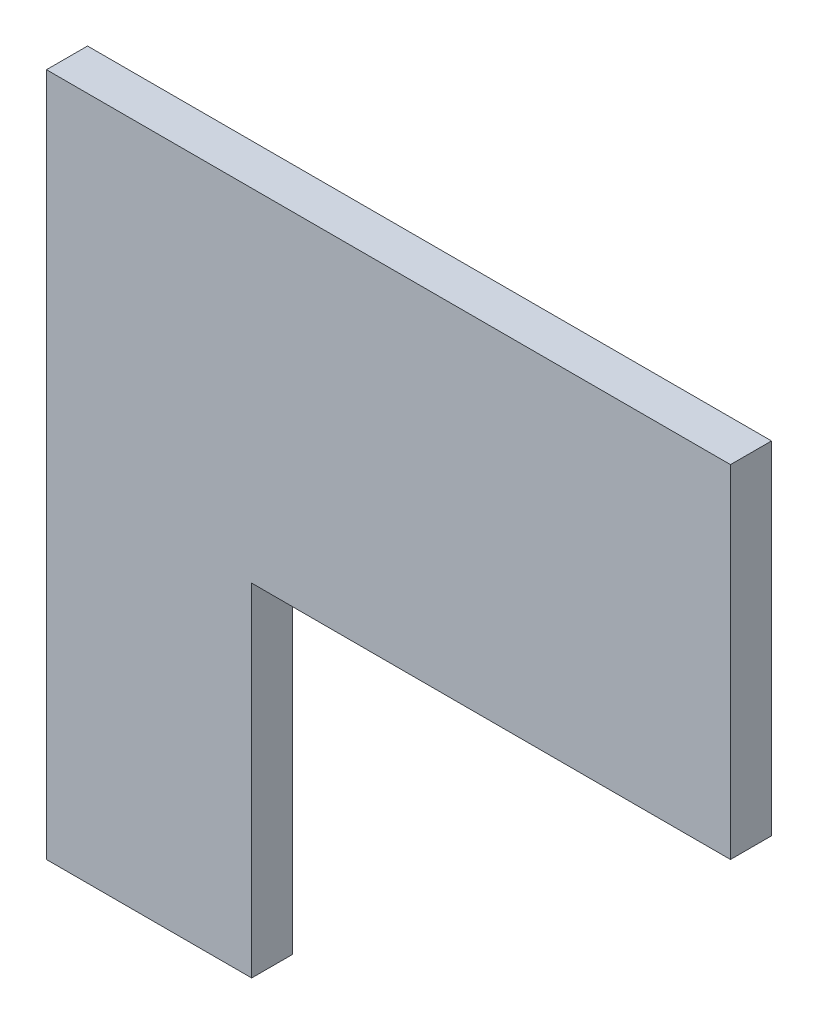
ISO-10303-21;
HEADER;
FILE_DESCRIPTION(('STEP AP214'),'2;1');
FILE_NAME('part.step','',(''),(''),'','','');
FILE_SCHEMA(('AUTOMOTIVE_DESIGN { 1 0 10303 214 1 1 1 1 }'));
ENDSEC;
DATA;
#1=APPLICATION_CONTEXT('core data for automotive mechanical design processes');
#2=APPLICATION_PROTOCOL_DEFINITION('international standard','automotive_design',2000,#1);
#3=PRODUCT_CONTEXT('',#1,'mechanical');
#4=PRODUCT('Part','Part','',(#3));
#5=PRODUCT_RELATED_PRODUCT_CATEGORY('part','',(#4));
#6=PRODUCT_DEFINITION_FORMATION('','',#4);
#7=PRODUCT_DEFINITION_CONTEXT('part definition',#1,'design');
#8=PRODUCT_DEFINITION('design','',#6,#7);
#9=PRODUCT_DEFINITION_SHAPE('','',#8);
#10=(LENGTH_UNIT() NAMED_UNIT(*) SI_UNIT(.MILLI.,.METRE.));
#11=(NAMED_UNIT(*) PLANE_ANGLE_UNIT() SI_UNIT($,.RADIAN.));
#12=(NAMED_UNIT(*) SI_UNIT($,.STERADIAN.) SOLID_ANGLE_UNIT());
#13=UNCERTAINTY_MEASURE_WITH_UNIT(LENGTH_MEASURE(1.E-05),#10,'distance_accuracy_value','');
#14=(GEOMETRIC_REPRESENTATION_CONTEXT(3) GLOBAL_UNCERTAINTY_ASSIGNED_CONTEXT((#13)) GLOBAL_UNIT_ASSIGNED_CONTEXT((#10,
#11,#12)) REPRESENTATION_CONTEXT('',''));
#15=CARTESIAN_POINT('',(0.,0.,0.));
#16=DIRECTION('',(0.,0.,1.));
#17=DIRECTION('',(1.,0.,0.));
#18=AXIS2_PLACEMENT_3D('',#15,#16,#17);
#19=CARTESIAN_POINT('',(5.00000016,0.,0.60000134));
#20=DIRECTION('',(0.,0.,-1.));
#21=DIRECTION('',(-1.,0.,0.));
#22=AXIS2_PLACEMENT_3D('',#19,#20,#21);
#23=PLANE('',#22);
#24=DIRECTION('',(1.,0.,0.));
#25=VECTOR('',#24,1.);
#26=CARTESIAN_POINT('',(-5.00000016,5.00000016,0.60000134));
#27=LINE('',#26,#25);
#28=CARTESIAN_POINT('',(-5.00000016,5.00000016,0.60000134));
#29=VERTEX_POINT('',#28);
#30=CARTESIAN_POINT('',(5.00000016,5.00000016,0.60000134));
#31=VERTEX_POINT('',#30);
#32=EDGE_CURVE('E101',#29,#31,#27,.T.);
#33=ORIENTED_EDGE('',*,*,#32,.F.);
#34=DIRECTION('',(0.,1.,0.));
#35=VECTOR('',#34,1.);
#36=CARTESIAN_POINT('',(-5.00000016,-5.00000016,0.60000134));
#37=LINE('',#36,#35);
#38=CARTESIAN_POINT('',(-5.00000016,-5.00000016,0.60000134));
#39=VERTEX_POINT('',#38);
#40=EDGE_CURVE('E96',#39,#29,#37,.T.);
#41=ORIENTED_EDGE('',*,*,#40,.F.);
#42=DIRECTION('',(1.,0.,0.));
#43=VECTOR('',#42,1.);
#44=CARTESIAN_POINT('',(-2.00000108,-5.00000016,0.60000134));
#45=LINE('',#44,#43);
#46=CARTESIAN_POINT('',(-2.00000108,-5.00000016,0.60000134));
#47=VERTEX_POINT('',#46);
#48=EDGE_CURVE('E82',#47,#39,#45,.F.);
#49=ORIENTED_EDGE('',*,*,#48,.F.);
#50=DIRECTION('',(0.,1.,0.));
#51=VECTOR('',#50,1.);
#52=CARTESIAN_POINT('',(-2.00000108,0.,0.60000134));
#53=LINE('',#52,#51);
#54=CARTESIAN_POINT('',(-2.00000108,0.,0.60000134));
#55=VERTEX_POINT('',#54);
#56=EDGE_CURVE('E67',#55,#47,#53,.F.);
#57=ORIENTED_EDGE('',*,*,#56,.F.);
#58=DIRECTION('',(1.,0.,0.));
#59=VECTOR('',#58,1.);
#60=CARTESIAN_POINT('',(5.00000016,0.,0.60000134));
#61=LINE('',#60,#59);
#62=CARTESIAN_POINT('',(5.00000016,0.,0.60000134));
#63=VERTEX_POINT('',#62);
#64=EDGE_CURVE('E20',#63,#55,#61,.F.);
#65=ORIENTED_EDGE('',*,*,#64,.F.);
#66=DIRECTION('',(0.,1.,0.));
#67=VECTOR('',#66,1.);
#68=CARTESIAN_POINT('',(5.00000016,5.00000016,0.60000134));
#69=LINE('',#68,#67);
#70=EDGE_CURVE('E104',#31,#63,#69,.F.);
#71=ORIENTED_EDGE('',*,*,#70,.F.);
#72=EDGE_LOOP('',(#33,#41,#49,#57,#65,#71));
#73=FACE_BOUND('',#72,.T.);
#74=ADVANCED_FACE('F17',(#73),#23,.F.);
#75=CARTESIAN_POINT('',(5.00000016,0.,0.));
#76=DIRECTION('',(0.,-1.,0.));
#77=DIRECTION('',(0.,0.,-1.));
#78=AXIS2_PLACEMENT_3D('',#75,#76,#77);
#79=PLANE('',#78);
#80=DIRECTION('',(0.,0.,-1.));
#81=VECTOR('',#80,1.);
#82=CARTESIAN_POINT('',(-2.00000108,0.,0.));
#83=LINE('',#82,#81);
#84=CARTESIAN_POINT('',(-2.00000108,0.,0.));
#85=VERTEX_POINT('',#84);
#86=EDGE_CURVE('E73',#85,#55,#83,.F.);
#87=ORIENTED_EDGE('',*,*,#86,.F.);
#88=DIRECTION('',(-1.,0.,0.));
#89=VECTOR('',#88,1.);
#90=CARTESIAN_POINT('',(5.00000016,0.,0.));
#91=LINE('',#90,#89);
#92=CARTESIAN_POINT('',(5.00000016,0.,0.));
#93=VERTEX_POINT('',#92);
#94=EDGE_CURVE('E107',#93,#85,#91,.T.);
#95=ORIENTED_EDGE('',*,*,#94,.F.);
#96=DIRECTION('',(0.,0.,-1.));
#97=VECTOR('',#96,1.);
#98=CARTESIAN_POINT('',(5.00000016,0.,0.));
#99=LINE('',#98,#97);
#100=EDGE_CURVE('E76',#63,#93,#99,.T.);
#101=ORIENTED_EDGE('',*,*,#100,.F.);
#102=ORIENTED_EDGE('',*,*,#64,.T.);
#103=EDGE_LOOP('',(#87,#95,#101,#102));
#104=FACE_BOUND('',#103,.T.);
#105=ADVANCED_FACE('F72',(#104),#79,.T.);
#106=CARTESIAN_POINT('',(-2.00000108,0.,0.));
#107=DIRECTION('',(1.,0.,0.));
#108=DIRECTION('',(0.,0.,-1.));
#109=AXIS2_PLACEMENT_3D('',#106,#107,#108);
#110=PLANE('',#109);
#111=DIRECTION('',(0.,0.,-1.));
#112=VECTOR('',#111,1.);
#113=CARTESIAN_POINT('',(-2.00000108,-5.00000016,0.));
#114=LINE('',#113,#112);
#115=CARTESIAN_POINT('',(-2.00000108,-5.00000016,0.));
#116=VERTEX_POINT('',#115);
#117=EDGE_CURVE('E84',#116,#47,#114,.F.);
#118=ORIENTED_EDGE('',*,*,#117,.F.);
#119=DIRECTION('',(0.,1.,0.));
#120=VECTOR('',#119,1.);
#121=CARTESIAN_POINT('',(-2.00000108,0.,0.));
#122=LINE('',#121,#120);
#123=EDGE_CURVE('E88',#85,#116,#122,.F.);
#124=ORIENTED_EDGE('',*,*,#123,.F.);
#125=ORIENTED_EDGE('',*,*,#86,.T.);
#126=ORIENTED_EDGE('',*,*,#56,.T.);
#127=EDGE_LOOP('',(#118,#124,#125,#126));
#128=FACE_BOUND('',#127,.T.);
#129=ADVANCED_FACE('F86',(#128),#110,.T.);
#130=CARTESIAN_POINT('',(-2.00000108,-5.00000016,0.));
#131=DIRECTION('',(0.,-1.,0.));
#132=DIRECTION('',(0.,0.,-1.));
#133=AXIS2_PLACEMENT_3D('',#130,#131,#132);
#134=PLANE('',#133);
#135=DIRECTION('',(0.,0.,1.));
#136=VECTOR('',#135,1.);
#137=CARTESIAN_POINT('',(-5.00000016,-5.00000016,0.));
#138=LINE('',#137,#136);
#139=CARTESIAN_POINT('',(-5.00000016,-5.00000016,0.));
#140=VERTEX_POINT('',#139);
#141=EDGE_CURVE('E93',#140,#39,#138,.T.);
#142=ORIENTED_EDGE('',*,*,#141,.F.);
#143=DIRECTION('',(-1.,0.,0.));
#144=VECTOR('',#143,1.);
#145=CARTESIAN_POINT('',(5.00000016,-5.00000016,0.));
#146=LINE('',#145,#144);
#147=EDGE_CURVE('E110',#116,#140,#146,.T.);
#148=ORIENTED_EDGE('',*,*,#147,.F.);
#149=ORIENTED_EDGE('',*,*,#117,.T.);
#150=ORIENTED_EDGE('',*,*,#48,.T.);
#151=EDGE_LOOP('',(#142,#148,#149,#150));
#152=FACE_BOUND('',#151,.T.);
#153=ADVANCED_FACE('F137',(#152),#134,.T.);
#154=CARTESIAN_POINT('',(-5.00000016,-5.00000016,0.));
#155=DIRECTION('',(-1.,0.,0.));
#156=DIRECTION('',(0.,0.,1.));
#157=AXIS2_PLACEMENT_3D('',#154,#155,#156);
#158=PLANE('',#157);
#159=DIRECTION('',(0.,0.,1.));
#160=VECTOR('',#159,1.);
#161=CARTESIAN_POINT('',(-5.00000016,5.00000016,0.));
#162=LINE('',#161,#160);
#163=CARTESIAN_POINT('',(-5.00000016,5.00000016,0.));
#164=VERTEX_POINT('',#163);
#165=EDGE_CURVE('E98',#164,#29,#162,.T.);
#166=ORIENTED_EDGE('',*,*,#165,.F.);
#167=DIRECTION('',(0.,1.,0.));
#168=VECTOR('',#167,1.);
#169=CARTESIAN_POINT('',(-5.00000016,0.,0.));
#170=LINE('',#169,#168);
#171=EDGE_CURVE('E113',#140,#164,#170,.T.);
#172=ORIENTED_EDGE('',*,*,#171,.F.);
#173=ORIENTED_EDGE('',*,*,#141,.T.);
#174=ORIENTED_EDGE('',*,*,#40,.T.);
#175=EDGE_LOOP('',(#166,#172,#173,#174));
#176=FACE_BOUND('',#175,.T.);
#177=ADVANCED_FACE('F122',(#176),#158,.T.);
#178=CARTESIAN_POINT('',(-5.00000016,5.00000016,0.));
#179=DIRECTION('',(0.,1.,0.));
#180=DIRECTION('',(0.,0.,1.));
#181=AXIS2_PLACEMENT_3D('',#178,#179,#180);
#182=PLANE('',#181);
#183=DIRECTION('',(0.,0.,-1.));
#184=VECTOR('',#183,1.);
#185=CARTESIAN_POINT('',(5.00000016,5.00000016,0.));
#186=LINE('',#185,#184);
#187=CARTESIAN_POINT('',(5.00000016,5.00000016,0.));
#188=VERTEX_POINT('',#187);
#189=EDGE_CURVE('E35',#188,#31,#186,.F.);
#190=ORIENTED_EDGE('',*,*,#189,.F.);
#191=DIRECTION('',(-1.,0.,0.));
#192=VECTOR('',#191,1.);
#193=CARTESIAN_POINT('',(5.00000016,5.00000016,0.));
#194=LINE('',#193,#192);
#195=EDGE_CURVE('E26',#164,#188,#194,.F.);
#196=ORIENTED_EDGE('',*,*,#195,.F.);
#197=ORIENTED_EDGE('',*,*,#165,.T.);
#198=ORIENTED_EDGE('',*,*,#32,.T.);
#199=EDGE_LOOP('',(#190,#196,#197,#198));
#200=FACE_BOUND('',#199,.T.);
#201=ADVANCED_FACE('F120',(#200),#182,.T.);
#202=CARTESIAN_POINT('',(5.00000016,5.00000016,0.));
#203=DIRECTION('',(1.,0.,0.));
#204=DIRECTION('',(0.,0.,-1.));
#205=AXIS2_PLACEMENT_3D('',#202,#203,#204);
#206=PLANE('',#205);
#207=ORIENTED_EDGE('',*,*,#100,.T.);
#208=DIRECTION('',(0.,1.,0.));
#209=VECTOR('',#208,1.);
#210=CARTESIAN_POINT('',(5.00000016,0.,0.));
#211=LINE('',#210,#209);
#212=EDGE_CURVE('E11',#188,#93,#211,.F.);
#213=ORIENTED_EDGE('',*,*,#212,.F.);
#214=ORIENTED_EDGE('',*,*,#189,.T.);
#215=ORIENTED_EDGE('',*,*,#70,.T.);
#216=EDGE_LOOP('',(#207,#213,#214,#215));
#217=FACE_BOUND('',#216,.T.);
#218=ADVANCED_FACE('F124',(#217),#206,.T.);
#219=CARTESIAN_POINT('',(5.00000016,0.,0.));
#220=DIRECTION('',(0.,0.,-1.));
#221=DIRECTION('',(-1.,0.,0.));
#222=AXIS2_PLACEMENT_3D('',#219,#220,#221);
#223=PLANE('',#222);
#224=ORIENTED_EDGE('',*,*,#195,.T.);
#225=ORIENTED_EDGE('',*,*,#212,.T.);
#226=ORIENTED_EDGE('',*,*,#94,.T.);
#227=ORIENTED_EDGE('',*,*,#123,.T.);
#228=ORIENTED_EDGE('',*,*,#147,.T.);
#229=ORIENTED_EDGE('',*,*,#171,.T.);
#230=EDGE_LOOP('',(#224,#225,#226,#227,#228,#229));
#231=FACE_BOUND('',#230,.T.);
#232=ADVANCED_FACE('F118',(#231),#223,.T.);
#233=CLOSED_SHELL('',(#74,#105,#129,#153,#177,#201,#218,#232));
#234=MANIFOLD_SOLID_BREP('B1',#233);
#235=ADVANCED_BREP_SHAPE_REPRESENTATION('',(#18,#234),#14);
#236=SHAPE_DEFINITION_REPRESENTATION(#9,#235);
ENDSEC;
END-ISO-10303-21;
